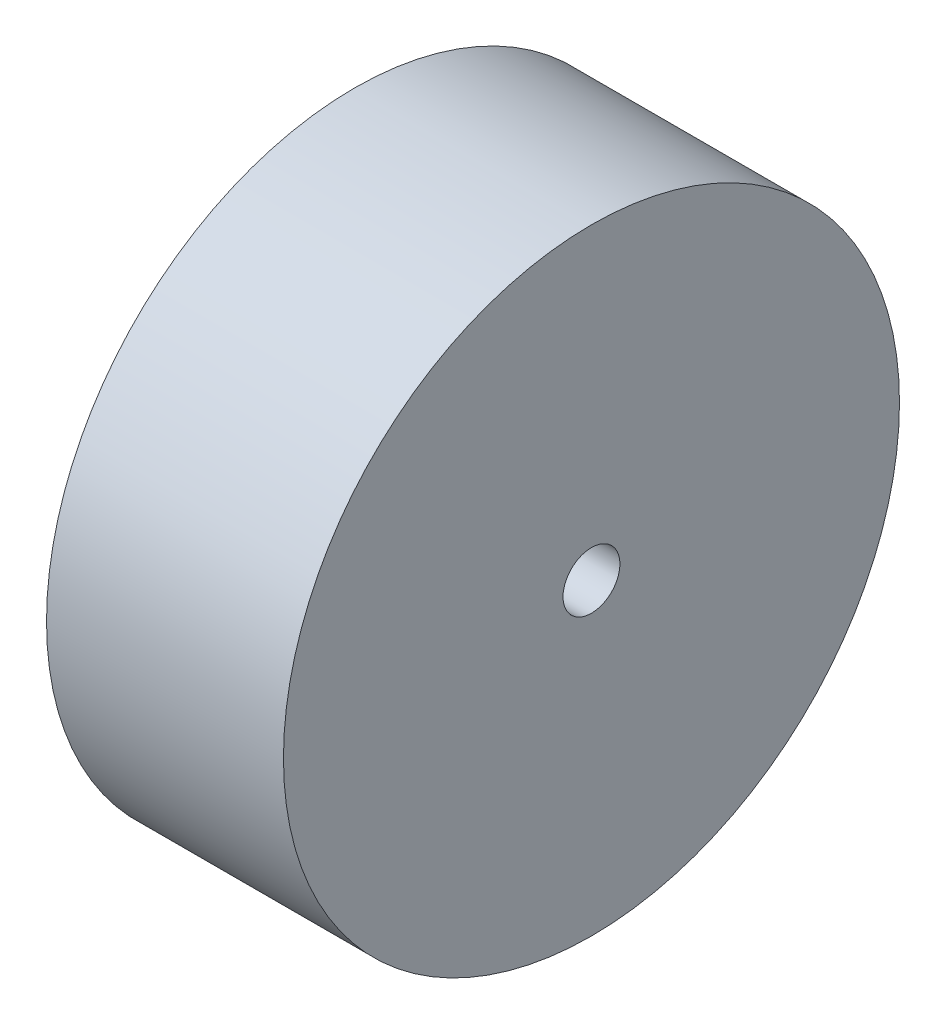
ISO-10303-21;
HEADER;
FILE_DESCRIPTION(('STEP AP214'),'2;1');
FILE_NAME('part.step','',(''),(''),'','','');
FILE_SCHEMA(('AUTOMOTIVE_DESIGN { 1 0 10303 214 1 1 1 1 }'));
ENDSEC;
DATA;
#1=APPLICATION_CONTEXT('core data for automotive mechanical design processes');
#2=APPLICATION_PROTOCOL_DEFINITION('international standard','automotive_design',2000,#1);
#3=PRODUCT_CONTEXT('',#1,'mechanical');
#4=PRODUCT('Part','Part','',(#3));
#5=PRODUCT_RELATED_PRODUCT_CATEGORY('part','',(#4));
#6=PRODUCT_DEFINITION_FORMATION('','',#4);
#7=PRODUCT_DEFINITION_CONTEXT('part definition',#1,'design');
#8=PRODUCT_DEFINITION('design','',#6,#7);
#9=PRODUCT_DEFINITION_SHAPE('','',#8);
#10=(LENGTH_UNIT() NAMED_UNIT(*) SI_UNIT(.MILLI.,.METRE.));
#11=(NAMED_UNIT(*) PLANE_ANGLE_UNIT() SI_UNIT($,.RADIAN.));
#12=(NAMED_UNIT(*) SI_UNIT($,.STERADIAN.) SOLID_ANGLE_UNIT());
#13=UNCERTAINTY_MEASURE_WITH_UNIT(LENGTH_MEASURE(1.E-05),#10,'distance_accuracy_value','');
#14=(GEOMETRIC_REPRESENTATION_CONTEXT(3) GLOBAL_UNCERTAINTY_ASSIGNED_CONTEXT((#13)) GLOBAL_UNIT_ASSIGNED_CONTEXT((#10,
#11,#12)) REPRESENTATION_CONTEXT('',''));
#15=CARTESIAN_POINT('',(0.,0.,0.));
#16=DIRECTION('',(0.,0.,1.));
#17=DIRECTION('',(1.,0.,0.));
#18=AXIS2_PLACEMENT_3D('',#15,#16,#17);
#19=CARTESIAN_POINT('',(25.,0.,0.));
#20=DIRECTION('',(-1.,0.,0.));
#21=DIRECTION('',(0.,0.,1.));
#22=AXIS2_PLACEMENT_3D('',#19,#20,#21);
#23=CYLINDRICAL_SURFACE('',#22,32.5);
#24=CARTESIAN_POINT('',(25.,0.,0.));
#25=DIRECTION('',(1.,0.,0.));
#26=DIRECTION('',(0.,0.,-1.));
#27=AXIS2_PLACEMENT_3D('',#24,#25,#26);
#28=CIRCLE('',#27,32.5);
#29=CARTESIAN_POINT('',(25.,0.,-32.5));
#30=VERTEX_POINT('',#29);
#31=EDGE_CURVE('E10',#30,#30,#28,.T.);
#32=ORIENTED_EDGE('',*,*,#31,.F.);
#33=EDGE_LOOP('',(#32));
#34=FACE_BOUND('',#33,.T.);
#35=CARTESIAN_POINT('',(0.,0.,0.));
#36=DIRECTION('',(1.,0.,0.));
#37=DIRECTION('',(0.,0.,-1.));
#38=AXIS2_PLACEMENT_3D('',#35,#36,#37);
#39=CIRCLE('',#38,32.5);
#40=CARTESIAN_POINT('',(0.,0.,-32.5));
#41=VERTEX_POINT('',#40);
#42=EDGE_CURVE('E36',#41,#41,#39,.T.);
#43=ORIENTED_EDGE('',*,*,#42,.T.);
#44=EDGE_LOOP('',(#43));
#45=FACE_BOUND('',#44,.T.);
#46=ADVANCED_FACE('F33',(#34,#45),#23,.T.);
#47=CARTESIAN_POINT('',(25.,0.,0.));
#48=DIRECTION('',(1.,0.,0.));
#49=DIRECTION('',(0.,0.,-1.));
#50=AXIS2_PLACEMENT_3D('',#47,#48,#49);
#51=PLANE('',#50);
#52=CARTESIAN_POINT('',(25.,0.,0.));
#53=DIRECTION('',(-1.,0.,0.));
#54=DIRECTION('',(0.,0.,1.));
#55=AXIS2_PLACEMENT_3D('',#52,#53,#54);
#56=CIRCLE('',#55,3.);
#57=CARTESIAN_POINT('',(25.,0.,3.));
#58=VERTEX_POINT('',#57);
#59=EDGE_CURVE('E43',#58,#58,#56,.T.);
#60=ORIENTED_EDGE('',*,*,#59,.T.);
#61=EDGE_LOOP('',(#60));
#62=FACE_BOUND('',#61,.T.);
#63=ORIENTED_EDGE('',*,*,#31,.T.);
#64=EDGE_LOOP('',(#63));
#65=FACE_BOUND('',#64,.T.);
#66=ADVANCED_FACE('F51',(#62,#65),#51,.T.);
#67=CARTESIAN_POINT('',(0.,0.,0.));
#68=DIRECTION('',(1.,0.,0.));
#69=DIRECTION('',(0.,0.,-1.));
#70=AXIS2_PLACEMENT_3D('',#67,#68,#69);
#71=PLANE('',#70);
#72=CARTESIAN_POINT('',(0.,0.,0.));
#73=DIRECTION('',(-1.,0.,0.));
#74=DIRECTION('',(0.,0.,1.));
#75=AXIS2_PLACEMENT_3D('',#72,#73,#74);
#76=CIRCLE('',#75,3.);
#77=CARTESIAN_POINT('',(0.,0.,3.));
#78=VERTEX_POINT('',#77);
#79=EDGE_CURVE('E45',#78,#78,#76,.T.);
#80=ORIENTED_EDGE('',*,*,#79,.F.);
#81=EDGE_LOOP('',(#80));
#82=FACE_BOUND('',#81,.T.);
#83=ORIENTED_EDGE('',*,*,#42,.F.);
#84=EDGE_LOOP('',(#83));
#85=FACE_BOUND('',#84,.T.);
#86=ADVANCED_FACE('F56',(#82,#85),#71,.F.);
#87=CARTESIAN_POINT('',(25.,0.,0.));
#88=DIRECTION('',(-1.,0.,0.));
#89=DIRECTION('',(0.,0.,1.));
#90=AXIS2_PLACEMENT_3D('',#87,#88,#89);
#91=CYLINDRICAL_SURFACE('',#90,3.);
#92=ORIENTED_EDGE('',*,*,#59,.F.);
#93=EDGE_LOOP('',(#92));
#94=FACE_BOUND('',#93,.T.);
#95=ORIENTED_EDGE('',*,*,#79,.T.);
#96=EDGE_LOOP('',(#95));
#97=FACE_BOUND('',#96,.T.);
#98=ADVANCED_FACE('F53',(#94,#97),#91,.F.);
#99=CLOSED_SHELL('',(#46,#66,#86,#98));
#100=MANIFOLD_SOLID_BREP('B2',#99);
#101=ADVANCED_BREP_SHAPE_REPRESENTATION('',(#18,#100),#14);
#102=SHAPE_DEFINITION_REPRESENTATION(#9,#101);
ENDSEC;
END-ISO-10303-21;
